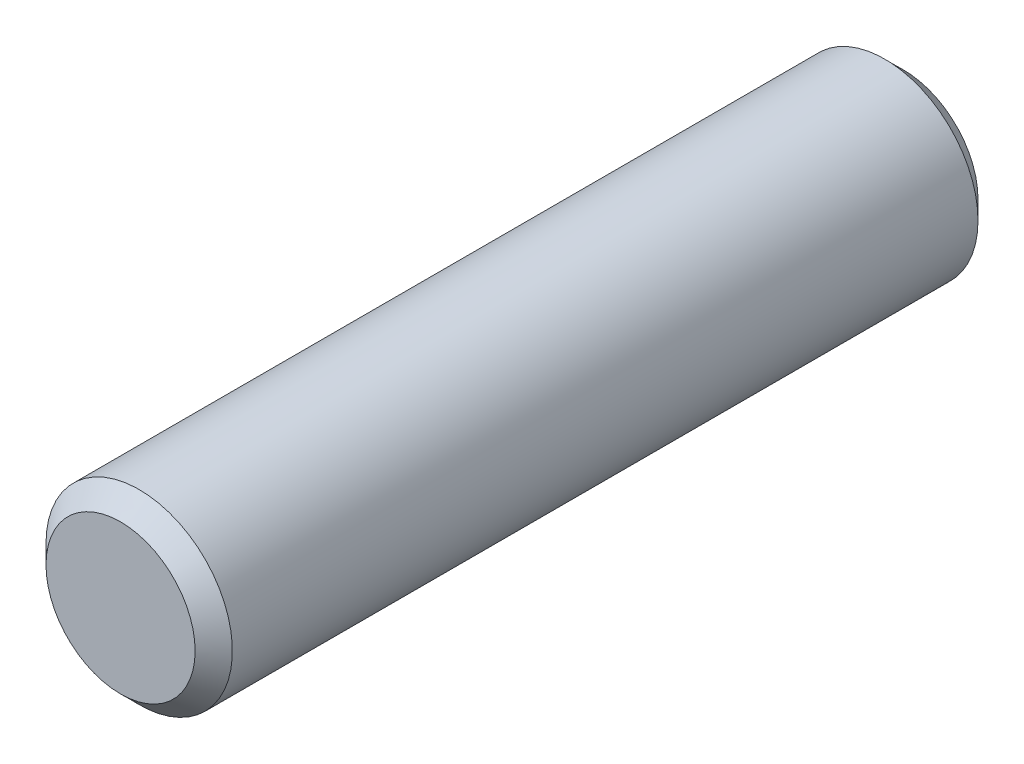
ISO-10303-21;
HEADER;
FILE_DESCRIPTION(('STEP AP214'),'2;1');
FILE_NAME('part.step','',(''),(''),'','','');
FILE_SCHEMA(('AUTOMOTIVE_DESIGN { 1 0 10303 214 1 1 1 1 }'));
ENDSEC;
DATA;
#1=APPLICATION_CONTEXT('core data for automotive mechanical design processes');
#2=APPLICATION_PROTOCOL_DEFINITION('international standard','automotive_design',2000,#1);
#3=PRODUCT_CONTEXT('',#1,'mechanical');
#4=PRODUCT('Part','Part','',(#3));
#5=PRODUCT_RELATED_PRODUCT_CATEGORY('part','',(#4));
#6=PRODUCT_DEFINITION_FORMATION('','',#4);
#7=PRODUCT_DEFINITION_CONTEXT('part definition',#1,'design');
#8=PRODUCT_DEFINITION('design','',#6,#7);
#9=PRODUCT_DEFINITION_SHAPE('','',#8);
#10=(LENGTH_UNIT() NAMED_UNIT(*) SI_UNIT(.MILLI.,.METRE.));
#11=(NAMED_UNIT(*) PLANE_ANGLE_UNIT() SI_UNIT($,.RADIAN.));
#12=(NAMED_UNIT(*) SI_UNIT($,.STERADIAN.) SOLID_ANGLE_UNIT());
#13=UNCERTAINTY_MEASURE_WITH_UNIT(LENGTH_MEASURE(1.E-05),#10,'distance_accuracy_value','');
#14=(GEOMETRIC_REPRESENTATION_CONTEXT(3) GLOBAL_UNCERTAINTY_ASSIGNED_CONTEXT((#13)) GLOBAL_UNIT_ASSIGNED_CONTEXT((#10,
#11,#12)) REPRESENTATION_CONTEXT('',''));
#15=CARTESIAN_POINT('',(0.,0.,0.));
#16=DIRECTION('',(0.,0.,1.));
#17=DIRECTION('',(1.,0.,0.));
#18=AXIS2_PLACEMENT_3D('',#15,#16,#17);
#19=CARTESIAN_POINT('',(0.,0.,84.));
#20=DIRECTION('',(0.,0.,-1.));
#21=DIRECTION('',(-1.,0.,0.));
#22=AXIS2_PLACEMENT_3D('',#19,#20,#21);
#23=CYLINDRICAL_SURFACE('',#22,10.);
#24=CARTESIAN_POINT('',(0.,0.,2.0000000000001));
#25=DIRECTION('',(0.,0.,1.));
#26=DIRECTION('',(1.,0.,0.));
#27=AXIS2_PLACEMENT_3D('',#24,#25,#26);
#28=CIRCLE('',#27,10.);
#29=CARTESIAN_POINT('',(-10.,0.,2.00000000000009));
#30=VERTEX_POINT('',#29);
#31=EDGE_CURVE('E43',#30,#30,#28,.T.);
#32=CARTESIAN_POINT('',(0.,0.,82.0000000000001));
#33=DIRECTION('',(0.,0.,1.));
#34=DIRECTION('',(1.,0.,0.));
#35=AXIS2_PLACEMENT_3D('',#32,#33,#34);
#36=CIRCLE('',#35,10.);
#37=CARTESIAN_POINT('',(-10.,0.,82.0000000000001));
#38=VERTEX_POINT('',#37);
#39=EDGE_CURVE('E47',#38,#38,#36,.F.);
#40=CARTESIAN_POINT('',(-10.,0.,2.00000000000009));
#41=CARTESIAN_POINT('',(-10.,0.,2.83333333333342));
#42=CARTESIAN_POINT('',(-10.,0.,3.66666666666675));
#43=CARTESIAN_POINT('',(-10.,0.,5.33333333333342));
#44=CARTESIAN_POINT('',(-10.,0.,6.16666666666675));
#45=CARTESIAN_POINT('',(-10.,0.,7.83333333333342));
#46=CARTESIAN_POINT('',(-10.,0.,8.66666666666675));
#47=CARTESIAN_POINT('',(-10.,0.,10.3333333333334));
#48=CARTESIAN_POINT('',(-10.,0.,11.1666666666667));
#49=CARTESIAN_POINT('',(-10.,0.,12.8333333333334));
#50=CARTESIAN_POINT('',(-10.,0.,13.6666666666667));
#51=CARTESIAN_POINT('',(-10.,0.,15.3333333333334));
#52=CARTESIAN_POINT('',(-10.,0.,16.1666666666667));
#53=CARTESIAN_POINT('',(-10.,0.,17.8333333333334));
#54=CARTESIAN_POINT('',(-10.,0.,18.6666666666668));
#55=CARTESIAN_POINT('',(-10.,0.,20.3333333333334));
#56=CARTESIAN_POINT('',(-10.,0.,21.1666666666667));
#57=CARTESIAN_POINT('',(-10.,0.,22.8333333333334));
#58=CARTESIAN_POINT('',(-10.,0.,23.6666666666667));
#59=CARTESIAN_POINT('',(-10.,0.,25.3333333333334));
#60=CARTESIAN_POINT('',(-10.,0.,26.1666666666667));
#61=CARTESIAN_POINT('',(-10.,0.,27.8333333333334));
#62=CARTESIAN_POINT('',(-10.,0.,28.6666666666667));
#63=CARTESIAN_POINT('',(-10.,0.,30.3333333333334));
#64=CARTESIAN_POINT('',(-10.,0.,31.1666666666667));
#65=CARTESIAN_POINT('',(-10.,0.,32.8333333333334));
#66=CARTESIAN_POINT('',(-10.,0.,33.6666666666667));
#67=CARTESIAN_POINT('',(-10.,0.,35.3333333333334));
#68=CARTESIAN_POINT('',(-10.,0.,36.1666666666667));
#69=CARTESIAN_POINT('',(-10.,0.,37.8333333333334));
#70=CARTESIAN_POINT('',(-10.,0.,38.6666666666667));
#71=CARTESIAN_POINT('',(-10.,0.,40.3333333333334));
#72=CARTESIAN_POINT('',(-10.,0.,41.1666666666667));
#73=CARTESIAN_POINT('',(-10.,0.,42.8333333333334));
#74=CARTESIAN_POINT('',(-10.,0.,43.6666666666667));
#75=CARTESIAN_POINT('',(-10.,0.,45.3333333333334));
#76=CARTESIAN_POINT('',(-10.,0.,46.1666666666667));
#77=CARTESIAN_POINT('',(-10.,0.,47.8333333333334));
#78=CARTESIAN_POINT('',(-10.,0.,48.6666666666667));
#79=CARTESIAN_POINT('',(-10.,0.,50.3333333333334));
#80=CARTESIAN_POINT('',(-10.,0.,51.1666666666667));
#81=CARTESIAN_POINT('',(-10.,0.,52.8333333333334));
#82=CARTESIAN_POINT('',(-10.,0.,53.6666666666667));
#83=CARTESIAN_POINT('',(-10.,0.,55.3333333333334));
#84=CARTESIAN_POINT('',(-10.,0.,56.1666666666667));
#85=CARTESIAN_POINT('',(-10.,0.,57.8333333333334));
#86=CARTESIAN_POINT('',(-10.,0.,58.6666666666667));
#87=CARTESIAN_POINT('',(-10.,0.,60.3333333333334));
#88=CARTESIAN_POINT('',(-10.,0.,61.1666666666667));
#89=CARTESIAN_POINT('',(-10.,0.,62.8333333333334));
#90=CARTESIAN_POINT('',(-10.,0.,63.6666666666667));
#91=CARTESIAN_POINT('',(-10.,0.,65.3333333333334));
#92=CARTESIAN_POINT('',(-10.,0.,66.1666666666667));
#93=CARTESIAN_POINT('',(-10.,0.,67.8333333333334));
#94=CARTESIAN_POINT('',(-10.,0.,68.6666666666667));
#95=CARTESIAN_POINT('',(-10.,0.,70.3333333333334));
#96=CARTESIAN_POINT('',(-10.,0.,71.1666666666667));
#97=CARTESIAN_POINT('',(-10.,0.,72.8333333333334));
#98=CARTESIAN_POINT('',(-10.,0.,73.6666666666667));
#99=CARTESIAN_POINT('',(-10.,0.,75.3333333333334));
#100=CARTESIAN_POINT('',(-10.,0.,76.1666666666667));
#101=CARTESIAN_POINT('',(-10.,0.,77.8333333333334));
#102=CARTESIAN_POINT('',(-10.,0.,78.6666666666667));
#103=CARTESIAN_POINT('',(-10.,0.,80.3333333333334));
#104=CARTESIAN_POINT('',(-10.,0.,81.1666666666667));
#105=CARTESIAN_POINT('',(-10.,0.,82.0000000000001));
#106=B_SPLINE_CURVE_WITH_KNOTS('',3,(#40,#41,#42,#43,#44,#45,#46,#47,#48,#49,#50,#51,#52,#53,
#54,#55,#56,#57,#58,#59,#60,#61,#62,#63,#64,#65,#66,#67,#68,#69,#70,#71,#72,#73,#74,#75,#76,#77,
#78,#79,#80,#81,#82,#83,#84,#85,#86,#87,#88,#89,#90,#91,#92,#93,#94,#95,#96,#97,#98,#99,#100,
#101,#102,#103,#104,#105),.UNSPECIFIED.,.F.,.F.,(4,2,2,2,2,2,2,2,2,2,2,2,2,2,2,2,2,2,2,2,2,2,2,
2,2,2,2,2,2,2,2,2,4),(0.,2.5,5.,7.49999999999999,9.99999999999999,12.5,15.,17.5,20.,22.5,25.,
27.5,30.,32.5,35.,37.5,40.,42.5,45.,47.5,50.,52.5,55.,57.5,60.,62.5,65.,67.5,70.,72.5,75.,77.5,
80.),.UNSPECIFIED.);
#107=EDGE_CURVE('BSEAM32',#30,#38,#106,.T.);
#108=ORIENTED_EDGE('',*,*,#31,.T.);
#109=ORIENTED_EDGE('',*,*,#39,.T.);
#110=ORIENTED_EDGE('',*,*,#107,.T.);
#111=ORIENTED_EDGE('',*,*,#107,.F.);
#112=EDGE_LOOP('',(#108,#110,#109,#111));
#113=FACE_BOUND('',#112,.T.);
#114=ADVANCED_FACE('F32',(#113),#23,.T.);
#115=CARTESIAN_POINT('',(0.,0.,84.));
#116=DIRECTION('',(0.,0.,1.));
#117=DIRECTION('',(1.,0.,0.));
#118=AXIS2_PLACEMENT_3D('',#115,#116,#117);
#119=PLANE('',#118);
#120=CARTESIAN_POINT('',(0.,0.,84.));
#121=DIRECTION('',(0.,0.,1.));
#122=DIRECTION('',(1.,0.,0.));
#123=AXIS2_PLACEMENT_3D('',#120,#121,#122);
#124=CIRCLE('',#123,8.00000000000006);
#125=CARTESIAN_POINT('',(8.00000000000006,0.,84.));
#126=VERTEX_POINT('',#125);
#127=EDGE_CURVE('E10',#126,#126,#124,.T.);
#128=ORIENTED_EDGE('',*,*,#127,.T.);
#129=EDGE_LOOP('',(#128));
#130=FACE_BOUND('',#129,.T.);
#131=ADVANCED_FACE('F63',(#130),#119,.T.);
#132=CARTESIAN_POINT('',(0.,0.,0.));
#133=DIRECTION('',(0.,0.,1.));
#134=DIRECTION('',(1.,0.,0.));
#135=AXIS2_PLACEMENT_3D('',#132,#133,#134);
#136=PLANE('',#135);
#137=CARTESIAN_POINT('',(0.,0.,0.));
#138=DIRECTION('',(0.,0.,1.));
#139=DIRECTION('',(1.,0.,0.));
#140=AXIS2_PLACEMENT_3D('',#137,#138,#139);
#141=CIRCLE('',#140,7.99999999999988);
#142=CARTESIAN_POINT('',(7.99999999999988,0.,0.));
#143=VERTEX_POINT('',#142);
#144=EDGE_CURVE('E39',#143,#143,#141,.F.);
#145=ORIENTED_EDGE('',*,*,#144,.T.);
#146=EDGE_LOOP('',(#145));
#147=FACE_BOUND('',#146,.T.);
#148=ADVANCED_FACE('F60',(#147),#136,.F.);
#149=CARTESIAN_POINT('',(0.,0.,2.0000000000001));
#150=DIRECTION('',(0.,0.,1.));
#151=DIRECTION('',(1.,0.,0.));
#152=AXIS2_PLACEMENT_3D('',#149,#150,#151);
#153=CONICAL_SURFACE('',#152,10.,0.785398163397453);
#154=ORIENTED_EDGE('',*,*,#144,.F.);
#155=EDGE_LOOP('',(#154));
#156=FACE_BOUND('',#155,.T.);
#157=ORIENTED_EDGE('',*,*,#31,.F.);
#158=EDGE_LOOP('',(#157));
#159=FACE_BOUND('',#158,.T.);
#160=ADVANCED_FACE('F56',(#156,#159),#153,.T.);
#161=CARTESIAN_POINT('',(0.,0.,84.));
#162=DIRECTION('',(0.,0.,-1.));
#163=DIRECTION('',(-1.,0.,0.));
#164=AXIS2_PLACEMENT_3D('',#161,#162,#163);
#165=CONICAL_SURFACE('',#164,8.00000000000006,0.785398163397447);
#166=ORIENTED_EDGE('',*,*,#39,.F.);
#167=EDGE_LOOP('',(#166));
#168=FACE_BOUND('',#167,.T.);
#169=ORIENTED_EDGE('',*,*,#127,.F.);
#170=EDGE_LOOP('',(#169));
#171=FACE_BOUND('',#170,.T.);
#172=ADVANCED_FACE('F34',(#168,#171),#165,.T.);
#173=CLOSED_SHELL('',(#114,#131,#148,#160,#172));
#174=MANIFOLD_SOLID_BREP('B2',#173);
#175=ADVANCED_BREP_SHAPE_REPRESENTATION('',(#18,#174),#14);
#176=SHAPE_DEFINITION_REPRESENTATION(#9,#175);
ENDSEC;
END-ISO-10303-21;
